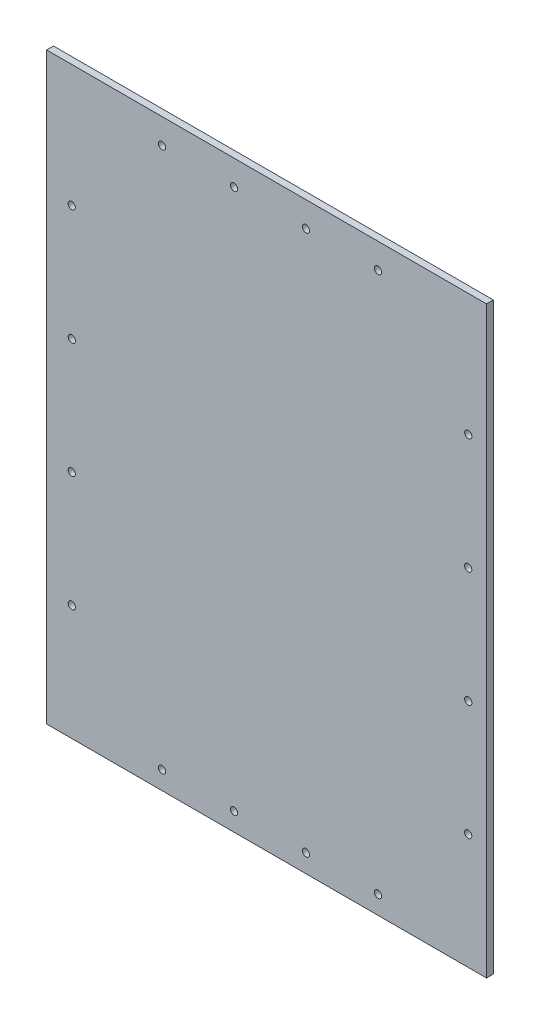
ISO-10303-21;
HEADER;
FILE_DESCRIPTION(('STEP AP214'),'2;1');
FILE_NAME('part.step','',(''),(''),'','','');
FILE_SCHEMA(('AUTOMOTIVE_DESIGN { 1 0 10303 214 1 1 1 1 }'));
ENDSEC;
DATA;
#1=APPLICATION_CONTEXT('core data for automotive mechanical design processes');
#2=APPLICATION_PROTOCOL_DEFINITION('international standard','automotive_design',2000,#1);
#3=PRODUCT_CONTEXT('',#1,'mechanical');
#4=PRODUCT('Part','Part','',(#3));
#5=PRODUCT_RELATED_PRODUCT_CATEGORY('part','',(#4));
#6=PRODUCT_DEFINITION_FORMATION('','',#4);
#7=PRODUCT_DEFINITION_CONTEXT('part definition',#1,'design');
#8=PRODUCT_DEFINITION('design','',#6,#7);
#9=PRODUCT_DEFINITION_SHAPE('','',#8);
#10=(LENGTH_UNIT() NAMED_UNIT(*) SI_UNIT(.MILLI.,.METRE.));
#11=(NAMED_UNIT(*) PLANE_ANGLE_UNIT() SI_UNIT($,.RADIAN.));
#12=(NAMED_UNIT(*) SI_UNIT($,.STERADIAN.) SOLID_ANGLE_UNIT());
#13=UNCERTAINTY_MEASURE_WITH_UNIT(LENGTH_MEASURE(1.E-05),#10,'distance_accuracy_value','');
#14=(GEOMETRIC_REPRESENTATION_CONTEXT(3) GLOBAL_UNCERTAINTY_ASSIGNED_CONTEXT((#13)) GLOBAL_UNIT_ASSIGNED_CONTEXT((#10,
#11,#12)) REPRESENTATION_CONTEXT('',''));
#15=CARTESIAN_POINT('',(0.,0.,0.));
#16=DIRECTION('',(0.,0.,1.));
#17=DIRECTION('',(1.,0.,0.));
#18=AXIS2_PLACEMENT_3D('',#15,#16,#17);
#19=CARTESIAN_POINT('',(-152.775,-202.775,4.75));
#20=DIRECTION('',(1.,0.,0.));
#21=DIRECTION('',(0.,0.,-1.));
#22=AXIS2_PLACEMENT_3D('',#19,#20,#21);
#23=PLANE('',#22);
#24=DIRECTION('',(0.,-1.,0.));
#25=VECTOR('',#24,1.);
#26=CARTESIAN_POINT('',(-152.775,-202.775,0.));
#27=LINE('',#26,#25);
#28=CARTESIAN_POINT('',(-152.775,202.775,0.));
#29=VERTEX_POINT('',#28);
#30=CARTESIAN_POINT('',(-152.775,-202.775,0.));
#31=VERTEX_POINT('',#30);
#32=EDGE_CURVE('E98',#29,#31,#27,.T.);
#33=ORIENTED_EDGE('',*,*,#32,.T.);
#34=DIRECTION('',(0.,0.,-1.));
#35=VECTOR('',#34,1.);
#36=CARTESIAN_POINT('',(-152.775,-202.775,4.75));
#37=LINE('',#36,#35);
#38=CARTESIAN_POINT('',(-152.775,-202.775,4.75));
#39=VERTEX_POINT('',#38);
#40=EDGE_CURVE('E11',#39,#31,#37,.T.);
#41=ORIENTED_EDGE('',*,*,#40,.F.);
#42=DIRECTION('',(0.,-1.,0.));
#43=VECTOR('',#42,1.);
#44=CARTESIAN_POINT('',(-152.775,-202.775,4.75));
#45=LINE('',#44,#43);
#46=CARTESIAN_POINT('',(-152.775,202.775,4.75));
#47=VERTEX_POINT('',#46);
#48=EDGE_CURVE('E85',#47,#39,#45,.T.);
#49=ORIENTED_EDGE('',*,*,#48,.F.);
#50=DIRECTION('',(0.,0.,-1.));
#51=VECTOR('',#50,1.);
#52=CARTESIAN_POINT('',(-152.775,202.775,4.75));
#53=LINE('',#52,#51);
#54=EDGE_CURVE('E94',#47,#29,#53,.T.);
#55=ORIENTED_EDGE('',*,*,#54,.T.);
#56=EDGE_LOOP('',(#33,#41,#49,#55));
#57=FACE_BOUND('',#56,.T.);
#58=ADVANCED_FACE('F32',(#57),#23,.F.);
#59=CARTESIAN_POINT('',(152.775,-202.775,4.75));
#60=DIRECTION('',(0.,1.,0.));
#61=DIRECTION('',(-1.,0.,0.));
#62=AXIS2_PLACEMENT_3D('',#59,#60,#61);
#63=PLANE('',#62);
#64=DIRECTION('',(1.,0.,0.));
#65=VECTOR('',#64,1.);
#66=CARTESIAN_POINT('',(152.775,-202.775,0.));
#67=LINE('',#66,#65);
#68=CARTESIAN_POINT('',(152.775,-202.775,0.));
#69=VERTEX_POINT('',#68);
#70=EDGE_CURVE('E89',#31,#69,#67,.T.);
#71=ORIENTED_EDGE('',*,*,#70,.T.);
#72=DIRECTION('',(0.,0.,-1.));
#73=VECTOR('',#72,1.);
#74=CARTESIAN_POINT('',(152.775,-202.775,4.75));
#75=LINE('',#74,#73);
#76=CARTESIAN_POINT('',(152.775,-202.775,4.75));
#77=VERTEX_POINT('',#76);
#78=EDGE_CURVE('E41',#77,#69,#75,.T.);
#79=ORIENTED_EDGE('',*,*,#78,.F.);
#80=DIRECTION('',(1.,0.,0.));
#81=VECTOR('',#80,1.);
#82=CARTESIAN_POINT('',(152.775,-202.775,4.75));
#83=LINE('',#82,#81);
#84=EDGE_CURVE('E80',#39,#77,#83,.T.);
#85=ORIENTED_EDGE('',*,*,#84,.F.);
#86=ORIENTED_EDGE('',*,*,#40,.T.);
#87=EDGE_LOOP('',(#71,#79,#85,#86));
#88=FACE_BOUND('',#87,.T.);
#89=ADVANCED_FACE('F88',(#88),#63,.F.);
#90=CARTESIAN_POINT('',(152.775,-202.775,4.75));
#91=DIRECTION('',(-1.,0.,0.));
#92=DIRECTION('',(0.,0.,1.));
#93=AXIS2_PLACEMENT_3D('',#90,#91,#92);
#94=PLANE('',#93);
#95=DIRECTION('',(0.,1.,0.));
#96=VECTOR('',#95,1.);
#97=CARTESIAN_POINT('',(152.775,-202.775,0.));
#98=LINE('',#97,#96);
#99=CARTESIAN_POINT('',(152.775,202.775,0.));
#100=VERTEX_POINT('',#99);
#101=EDGE_CURVE('E67',#69,#100,#98,.T.);
#102=ORIENTED_EDGE('',*,*,#101,.T.);
#103=DIRECTION('',(0.,0.,-1.));
#104=VECTOR('',#103,1.);
#105=CARTESIAN_POINT('',(152.775,202.775,4.75));
#106=LINE('',#105,#104);
#107=CARTESIAN_POINT('',(152.775,202.775,4.75));
#108=VERTEX_POINT('',#107);
#109=EDGE_CURVE('E90',#108,#100,#106,.T.);
#110=ORIENTED_EDGE('',*,*,#109,.F.);
#111=DIRECTION('',(0.,1.,0.));
#112=VECTOR('',#111,1.);
#113=CARTESIAN_POINT('',(152.775,-202.775,4.75));
#114=LINE('',#113,#112);
#115=EDGE_CURVE('E83',#77,#108,#114,.T.);
#116=ORIENTED_EDGE('',*,*,#115,.F.);
#117=ORIENTED_EDGE('',*,*,#78,.T.);
#118=EDGE_LOOP('',(#102,#110,#116,#117));
#119=FACE_BOUND('',#118,.T.);
#120=ADVANCED_FACE('F92',(#119),#94,.F.);
#121=CARTESIAN_POINT('',(152.775,202.775,4.75));
#122=DIRECTION('',(0.,-1.,0.));
#123=DIRECTION('',(1.,0.,0.));
#124=AXIS2_PLACEMENT_3D('',#121,#122,#123);
#125=PLANE('',#124);
#126=DIRECTION('',(-1.,0.,0.));
#127=VECTOR('',#126,1.);
#128=CARTESIAN_POINT('',(152.775,202.775,0.));
#129=LINE('',#128,#127);
#130=EDGE_CURVE('E73',#100,#29,#129,.T.);
#131=ORIENTED_EDGE('',*,*,#130,.T.);
#132=ORIENTED_EDGE('',*,*,#54,.F.);
#133=DIRECTION('',(-1.,0.,0.));
#134=VECTOR('',#133,1.);
#135=CARTESIAN_POINT('',(152.775,202.775,4.75));
#136=LINE('',#135,#134);
#137=EDGE_CURVE('E50',#108,#47,#136,.T.);
#138=ORIENTED_EDGE('',*,*,#137,.F.);
#139=ORIENTED_EDGE('',*,*,#109,.T.);
#140=EDGE_LOOP('',(#131,#132,#138,#139));
#141=FACE_BOUND('',#140,.T.);
#142=ADVANCED_FACE('F245',(#141),#125,.F.);
#143=CARTESIAN_POINT('',(0.,0.,4.75));
#144=DIRECTION('',(0.,0.,1.));
#145=DIRECTION('',(1.,0.,0.));
#146=AXIS2_PLACEMENT_3D('',#143,#144,#145);
#147=PLANE('',#146);
#148=CARTESIAN_POINT('',(77.375,-190.075,4.75));
#149=DIRECTION('',(0.,0.,1.));
#150=DIRECTION('',(1.,0.,0.));
#151=AXIS2_PLACEMENT_3D('',#148,#149,#150);
#152=CIRCLE('',#151,2.50000000000001);
#153=CARTESIAN_POINT('',(79.875,-190.075,4.75));
#154=VERTEX_POINT('',#153);
#155=EDGE_CURVE('E185',#154,#154,#152,.T.);
#156=ORIENTED_EDGE('',*,*,#155,.F.);
#157=EDGE_LOOP('',(#156));
#158=FACE_BOUND('',#157,.T.);
#159=CARTESIAN_POINT('',(27.375,-190.075,4.75));
#160=DIRECTION('',(0.,0.,1.));
#161=DIRECTION('',(1.,0.,0.));
#162=AXIS2_PLACEMENT_3D('',#159,#160,#161);
#163=CIRCLE('',#162,2.5);
#164=CARTESIAN_POINT('',(29.875,-190.075,4.75));
#165=VERTEX_POINT('',#164);
#166=EDGE_CURVE('E188',#165,#165,#163,.T.);
#167=ORIENTED_EDGE('',*,*,#166,.F.);
#168=EDGE_LOOP('',(#167));
#169=FACE_BOUND('',#168,.T.);
#170=CARTESIAN_POINT('',(-22.625,-190.075,4.75));
#171=DIRECTION('',(0.,0.,1.));
#172=DIRECTION('',(1.,0.,0.));
#173=AXIS2_PLACEMENT_3D('',#170,#171,#172);
#174=CIRCLE('',#173,2.5);
#175=CARTESIAN_POINT('',(-20.125,-190.075,4.75));
#176=VERTEX_POINT('',#175);
#177=EDGE_CURVE('E191',#176,#176,#174,.T.);
#178=ORIENTED_EDGE('',*,*,#177,.F.);
#179=EDGE_LOOP('',(#178));
#180=FACE_BOUND('',#179,.T.);
#181=CARTESIAN_POINT('',(-72.6250000000001,-190.075,4.75));
#182=DIRECTION('',(0.,0.,1.));
#183=DIRECTION('',(1.,0.,0.));
#184=AXIS2_PLACEMENT_3D('',#181,#182,#183);
#185=CIRCLE('',#184,2.5);
#186=CARTESIAN_POINT('',(-70.125,-190.075,4.75));
#187=VERTEX_POINT('',#186);
#188=EDGE_CURVE('E194',#187,#187,#185,.T.);
#189=ORIENTED_EDGE('',*,*,#188,.F.);
#190=EDGE_LOOP('',(#189));
#191=FACE_BOUND('',#190,.T.);
#192=CARTESIAN_POINT('',(-72.6250000000001,185.325,4.75));
#193=DIRECTION('',(0.,0.,1.));
#194=DIRECTION('',(1.,0.,0.));
#195=AXIS2_PLACEMENT_3D('',#192,#193,#194);
#196=CIRCLE('',#195,2.5);
#197=CARTESIAN_POINT('',(-70.125,185.325,4.75));
#198=VERTEX_POINT('',#197);
#199=EDGE_CURVE('E154',#198,#198,#196,.T.);
#200=ORIENTED_EDGE('',*,*,#199,.F.);
#201=EDGE_LOOP('',(#200));
#202=FACE_BOUND('',#201,.T.);
#203=CARTESIAN_POINT('',(77.375,185.325,4.75));
#204=DIRECTION('',(0.,0.,1.));
#205=DIRECTION('',(1.,0.,0.));
#206=AXIS2_PLACEMENT_3D('',#203,#204,#205);
#207=CIRCLE('',#206,2.50000000000001);
#208=CARTESIAN_POINT('',(79.875,185.325,4.75));
#209=VERTEX_POINT('',#208);
#210=EDGE_CURVE('E164',#209,#209,#207,.T.);
#211=ORIENTED_EDGE('',*,*,#210,.F.);
#212=EDGE_LOOP('',(#211));
#213=FACE_BOUND('',#212,.T.);
#214=CARTESIAN_POINT('',(27.375,185.325,4.75));
#215=DIRECTION('',(0.,0.,1.));
#216=DIRECTION('',(1.,0.,0.));
#217=AXIS2_PLACEMENT_3D('',#214,#215,#216);
#218=CIRCLE('',#217,2.5);
#219=CARTESIAN_POINT('',(29.875,185.325,4.75));
#220=VERTEX_POINT('',#219);
#221=EDGE_CURVE('E167',#220,#220,#218,.T.);
#222=ORIENTED_EDGE('',*,*,#221,.F.);
#223=EDGE_LOOP('',(#222));
#224=FACE_BOUND('',#223,.T.);
#225=CARTESIAN_POINT('',(-22.625,185.325,4.75));
#226=DIRECTION('',(0.,0.,1.));
#227=DIRECTION('',(1.,0.,0.));
#228=AXIS2_PLACEMENT_3D('',#225,#226,#227);
#229=CIRCLE('',#228,2.5);
#230=CARTESIAN_POINT('',(-20.125,185.325,4.75));
#231=VERTEX_POINT('',#230);
#232=EDGE_CURVE('E170',#231,#231,#229,.T.);
#233=ORIENTED_EDGE('',*,*,#232,.F.);
#234=EDGE_LOOP('',(#233));
#235=FACE_BOUND('',#234,.T.);
#236=CARTESIAN_POINT('',(-135.325,-122.615,4.75));
#237=DIRECTION('',(0.,0.,1.));
#238=DIRECTION('',(1.,0.,0.));
#239=AXIS2_PLACEMENT_3D('',#236,#237,#238);
#240=CIRCLE('',#239,2.5);
#241=CARTESIAN_POINT('',(-132.825,-122.615,4.75));
#242=VERTEX_POINT('',#241);
#243=EDGE_CURVE('E123',#242,#242,#240,.T.);
#244=ORIENTED_EDGE('',*,*,#243,.F.);
#245=EDGE_LOOP('',(#244));
#246=FACE_BOUND('',#245,.T.);
#247=CARTESIAN_POINT('',(-135.325,-42.455,4.75));
#248=DIRECTION('',(0.,0.,1.));
#249=DIRECTION('',(1.,0.,0.));
#250=AXIS2_PLACEMENT_3D('',#247,#248,#249);
#251=CIRCLE('',#250,2.5);
#252=CARTESIAN_POINT('',(-132.825,-42.455,4.75));
#253=VERTEX_POINT('',#252);
#254=EDGE_CURVE('E157',#253,#253,#251,.T.);
#255=ORIENTED_EDGE('',*,*,#254,.F.);
#256=EDGE_LOOP('',(#255));
#257=FACE_BOUND('',#256,.T.);
#258=CARTESIAN_POINT('',(-135.325,37.705,4.75));
#259=DIRECTION('',(0.,0.,1.));
#260=DIRECTION('',(1.,0.,0.));
#261=AXIS2_PLACEMENT_3D('',#258,#259,#260);
#262=CIRCLE('',#261,2.5);
#263=CARTESIAN_POINT('',(-132.825,37.705,4.75));
#264=VERTEX_POINT('',#263);
#265=EDGE_CURVE('E153',#264,#264,#262,.T.);
#266=ORIENTED_EDGE('',*,*,#265,.F.);
#267=EDGE_LOOP('',(#266));
#268=FACE_BOUND('',#267,.T.);
#269=CARTESIAN_POINT('',(-135.325,117.865,4.75));
#270=DIRECTION('',(0.,0.,1.));
#271=DIRECTION('',(1.,0.,0.));
#272=AXIS2_PLACEMENT_3D('',#269,#270,#271);
#273=CIRCLE('',#272,2.5);
#274=CARTESIAN_POINT('',(-132.825,117.865,4.75));
#275=VERTEX_POINT('',#274);
#276=EDGE_CURVE('E150',#275,#275,#273,.T.);
#277=ORIENTED_EDGE('',*,*,#276,.F.);
#278=EDGE_LOOP('',(#277));
#279=FACE_BOUND('',#278,.T.);
#280=CARTESIAN_POINT('',(140.075,-122.615,4.75));
#281=DIRECTION('',(0.,0.,1.));
#282=DIRECTION('',(1.,0.,0.));
#283=AXIS2_PLACEMENT_3D('',#280,#281,#282);
#284=CIRCLE('',#283,2.5);
#285=CARTESIAN_POINT('',(142.575,-122.615,4.75));
#286=VERTEX_POINT('',#285);
#287=EDGE_CURVE('E130',#286,#286,#284,.T.);
#288=ORIENTED_EDGE('',*,*,#287,.F.);
#289=EDGE_LOOP('',(#288));
#290=FACE_BOUND('',#289,.T.);
#291=CARTESIAN_POINT('',(140.075,-42.455,4.75));
#292=DIRECTION('',(0.,0.,1.));
#293=DIRECTION('',(1.,0.,0.));
#294=AXIS2_PLACEMENT_3D('',#291,#292,#293);
#295=CIRCLE('',#294,2.5);
#296=CARTESIAN_POINT('',(142.575,-42.455,4.75));
#297=VERTEX_POINT('',#296);
#298=EDGE_CURVE('E134',#297,#297,#295,.T.);
#299=ORIENTED_EDGE('',*,*,#298,.F.);
#300=EDGE_LOOP('',(#299));
#301=FACE_BOUND('',#300,.T.);
#302=CARTESIAN_POINT('',(140.075,117.865,4.75));
#303=DIRECTION('',(0.,0.,1.));
#304=DIRECTION('',(1.,0.,0.));
#305=AXIS2_PLACEMENT_3D('',#302,#303,#304);
#306=CIRCLE('',#305,2.5);
#307=CARTESIAN_POINT('',(142.575,117.865,4.75));
#308=VERTEX_POINT('',#307);
#309=EDGE_CURVE('E139',#308,#308,#306,.T.);
#310=ORIENTED_EDGE('',*,*,#309,.F.);
#311=EDGE_LOOP('',(#310));
#312=FACE_BOUND('',#311,.T.);
#313=CARTESIAN_POINT('',(140.075,37.705,4.75));
#314=DIRECTION('',(0.,0.,1.));
#315=DIRECTION('',(1.,0.,0.));
#316=AXIS2_PLACEMENT_3D('',#313,#314,#315);
#317=CIRCLE('',#316,2.5);
#318=CARTESIAN_POINT('',(142.575,37.705,4.75));
#319=VERTEX_POINT('',#318);
#320=EDGE_CURVE('E111',#319,#319,#317,.T.);
#321=ORIENTED_EDGE('',*,*,#320,.F.);
#322=EDGE_LOOP('',(#321));
#323=FACE_BOUND('',#322,.T.);
#324=ORIENTED_EDGE('',*,*,#48,.T.);
#325=ORIENTED_EDGE('',*,*,#84,.T.);
#326=ORIENTED_EDGE('',*,*,#115,.T.);
#327=ORIENTED_EDGE('',*,*,#137,.T.);
#328=EDGE_LOOP('',(#324,#325,#326,#327));
#329=FACE_BOUND('',#328,.T.);
#330=ADVANCED_FACE('F81',(#158,#169,#180,#191,#202,#213,#224,#235,#246,#257,#268,#279,#290,#301,
#312,#323,#329),#147,.T.);
#331=CARTESIAN_POINT('',(0.,0.,0.));
#332=DIRECTION('',(0.,0.,1.));
#333=DIRECTION('',(1.,0.,0.));
#334=AXIS2_PLACEMENT_3D('',#331,#332,#333);
#335=PLANE('',#334);
#336=CARTESIAN_POINT('',(77.375,-190.075,0.));
#337=DIRECTION('',(0.,0.,-1.));
#338=DIRECTION('',(-1.,0.,0.));
#339=AXIS2_PLACEMENT_3D('',#336,#337,#338);
#340=CIRCLE('',#339,2.50000000000001);
#341=CARTESIAN_POINT('',(74.8749999999999,-190.075,0.));
#342=VERTEX_POINT('',#341);
#343=EDGE_CURVE('E197',#342,#342,#340,.T.);
#344=ORIENTED_EDGE('',*,*,#343,.F.);
#345=EDGE_LOOP('',(#344));
#346=FACE_BOUND('',#345,.T.);
#347=CARTESIAN_POINT('',(27.375,-190.075,0.));
#348=DIRECTION('',(0.,0.,-1.));
#349=DIRECTION('',(-1.,0.,0.));
#350=AXIS2_PLACEMENT_3D('',#347,#348,#349);
#351=CIRCLE('',#350,2.5);
#352=CARTESIAN_POINT('',(24.875,-190.075,0.));
#353=VERTEX_POINT('',#352);
#354=EDGE_CURVE('E204',#353,#353,#351,.T.);
#355=ORIENTED_EDGE('',*,*,#354,.F.);
#356=EDGE_LOOP('',(#355));
#357=FACE_BOUND('',#356,.T.);
#358=CARTESIAN_POINT('',(-22.625,-190.075,0.));
#359=DIRECTION('',(0.,0.,-1.));
#360=DIRECTION('',(-1.,0.,0.));
#361=AXIS2_PLACEMENT_3D('',#358,#359,#360);
#362=CIRCLE('',#361,2.5);
#363=CARTESIAN_POINT('',(-25.125,-190.075,0.));
#364=VERTEX_POINT('',#363);
#365=EDGE_CURVE('E201',#364,#364,#362,.T.);
#366=ORIENTED_EDGE('',*,*,#365,.F.);
#367=EDGE_LOOP('',(#366));
#368=FACE_BOUND('',#367,.T.);
#369=CARTESIAN_POINT('',(-72.6250000000001,-190.075,0.));
#370=DIRECTION('',(0.,0.,-1.));
#371=DIRECTION('',(-1.,0.,0.));
#372=AXIS2_PLACEMENT_3D('',#369,#370,#371);
#373=CIRCLE('',#372,2.5);
#374=CARTESIAN_POINT('',(-75.1250000000001,-190.075,0.));
#375=VERTEX_POINT('',#374);
#376=EDGE_CURVE('E198',#375,#375,#373,.T.);
#377=ORIENTED_EDGE('',*,*,#376,.F.);
#378=EDGE_LOOP('',(#377));
#379=FACE_BOUND('',#378,.T.);
#380=CARTESIAN_POINT('',(-72.6250000000001,185.325,0.));
#381=DIRECTION('',(0.,0.,-1.));
#382=DIRECTION('',(-1.,0.,0.));
#383=AXIS2_PLACEMENT_3D('',#380,#381,#382);
#384=CIRCLE('',#383,2.5);
#385=CARTESIAN_POINT('',(-75.1250000000001,185.325,0.));
#386=VERTEX_POINT('',#385);
#387=EDGE_CURVE('E176',#386,#386,#384,.T.);
#388=ORIENTED_EDGE('',*,*,#387,.F.);
#389=EDGE_LOOP('',(#388));
#390=FACE_BOUND('',#389,.T.);
#391=CARTESIAN_POINT('',(77.375,185.325,0.));
#392=DIRECTION('',(0.,0.,-1.));
#393=DIRECTION('',(-1.,0.,0.));
#394=AXIS2_PLACEMENT_3D('',#391,#392,#393);
#395=CIRCLE('',#394,2.50000000000001);
#396=CARTESIAN_POINT('',(74.8749999999999,185.325,0.));
#397=VERTEX_POINT('',#396);
#398=EDGE_CURVE('E177',#397,#397,#395,.T.);
#399=ORIENTED_EDGE('',*,*,#398,.F.);
#400=EDGE_LOOP('',(#399));
#401=FACE_BOUND('',#400,.T.);
#402=CARTESIAN_POINT('',(27.375,185.325,0.));
#403=DIRECTION('',(0.,0.,-1.));
#404=DIRECTION('',(-1.,0.,0.));
#405=AXIS2_PLACEMENT_3D('',#402,#403,#404);
#406=CIRCLE('',#405,2.5);
#407=CARTESIAN_POINT('',(24.875,185.325,0.));
#408=VERTEX_POINT('',#407);
#409=EDGE_CURVE('E180',#408,#408,#406,.T.);
#410=ORIENTED_EDGE('',*,*,#409,.F.);
#411=EDGE_LOOP('',(#410));
#412=FACE_BOUND('',#411,.T.);
#413=CARTESIAN_POINT('',(-22.625,185.325,0.));
#414=DIRECTION('',(0.,0.,-1.));
#415=DIRECTION('',(-1.,0.,0.));
#416=AXIS2_PLACEMENT_3D('',#413,#414,#415);
#417=CIRCLE('',#416,2.5);
#418=CARTESIAN_POINT('',(-25.125,185.325,0.));
#419=VERTEX_POINT('',#418);
#420=EDGE_CURVE('E173',#419,#419,#417,.T.);
#421=ORIENTED_EDGE('',*,*,#420,.F.);
#422=EDGE_LOOP('',(#421));
#423=FACE_BOUND('',#422,.T.);
#424=CARTESIAN_POINT('',(-135.325,-122.615,0.));
#425=DIRECTION('',(0.,0.,1.));
#426=DIRECTION('',(1.,0.,0.));
#427=AXIS2_PLACEMENT_3D('',#424,#425,#426);
#428=CIRCLE('',#427,2.5);
#429=CARTESIAN_POINT('',(-132.825,-122.615,0.));
#430=VERTEX_POINT('',#429);
#431=EDGE_CURVE('E35',#430,#430,#428,.T.);
#432=ORIENTED_EDGE('',*,*,#431,.T.);
#433=EDGE_LOOP('',(#432));
#434=FACE_BOUND('',#433,.T.);
#435=CARTESIAN_POINT('',(-135.325,-42.455,0.));
#436=DIRECTION('',(0.,0.,1.));
#437=DIRECTION('',(1.,0.,0.));
#438=AXIS2_PLACEMENT_3D('',#435,#436,#437);
#439=CIRCLE('',#438,2.5);
#440=CARTESIAN_POINT('',(-132.825,-42.455,0.));
#441=VERTEX_POINT('',#440);
#442=EDGE_CURVE('E125',#441,#441,#439,.T.);
#443=ORIENTED_EDGE('',*,*,#442,.T.);
#444=EDGE_LOOP('',(#443));
#445=FACE_BOUND('',#444,.T.);
#446=CARTESIAN_POINT('',(-135.325,37.705,0.));
#447=DIRECTION('',(0.,0.,1.));
#448=DIRECTION('',(1.,0.,0.));
#449=AXIS2_PLACEMENT_3D('',#446,#447,#448);
#450=CIRCLE('',#449,2.5);
#451=CARTESIAN_POINT('',(-132.825,37.705,0.));
#452=VERTEX_POINT('',#451);
#453=EDGE_CURVE('E122',#452,#452,#450,.T.);
#454=ORIENTED_EDGE('',*,*,#453,.T.);
#455=EDGE_LOOP('',(#454));
#456=FACE_BOUND('',#455,.T.);
#457=CARTESIAN_POINT('',(-135.325,117.865,0.));
#458=DIRECTION('',(0.,0.,1.));
#459=DIRECTION('',(1.,0.,0.));
#460=AXIS2_PLACEMENT_3D('',#457,#458,#459);
#461=CIRCLE('',#460,2.5);
#462=CARTESIAN_POINT('',(-132.825,117.865,0.));
#463=VERTEX_POINT('',#462);
#464=EDGE_CURVE('E119',#463,#463,#461,.T.);
#465=ORIENTED_EDGE('',*,*,#464,.T.);
#466=EDGE_LOOP('',(#465));
#467=FACE_BOUND('',#466,.T.);
#468=CARTESIAN_POINT('',(140.075,-122.615,0.));
#469=DIRECTION('',(0.,0.,1.));
#470=DIRECTION('',(1.,0.,0.));
#471=AXIS2_PLACEMENT_3D('',#468,#469,#470);
#472=CIRCLE('',#471,2.5);
#473=CARTESIAN_POINT('',(142.575,-122.615,0.));
#474=VERTEX_POINT('',#473);
#475=EDGE_CURVE('E101',#474,#474,#472,.T.);
#476=ORIENTED_EDGE('',*,*,#475,.T.);
#477=EDGE_LOOP('',(#476));
#478=FACE_BOUND('',#477,.T.);
#479=CARTESIAN_POINT('',(140.075,-42.455,0.));
#480=DIRECTION('',(0.,0.,1.));
#481=DIRECTION('',(1.,0.,0.));
#482=AXIS2_PLACEMENT_3D('',#479,#480,#481);
#483=CIRCLE('',#482,2.5);
#484=CARTESIAN_POINT('',(142.575,-42.455,0.));
#485=VERTEX_POINT('',#484);
#486=EDGE_CURVE('E114',#485,#485,#483,.T.);
#487=ORIENTED_EDGE('',*,*,#486,.T.);
#488=EDGE_LOOP('',(#487));
#489=FACE_BOUND('',#488,.T.);
#490=CARTESIAN_POINT('',(140.075,117.865,0.));
#491=DIRECTION('',(0.,0.,1.));
#492=DIRECTION('',(1.,0.,0.));
#493=AXIS2_PLACEMENT_3D('',#490,#491,#492);
#494=CIRCLE('',#493,2.5);
#495=CARTESIAN_POINT('',(142.575,117.865,0.));
#496=VERTEX_POINT('',#495);
#497=EDGE_CURVE('E110',#496,#496,#494,.T.);
#498=ORIENTED_EDGE('',*,*,#497,.T.);
#499=EDGE_LOOP('',(#498));
#500=FACE_BOUND('',#499,.T.);
#501=CARTESIAN_POINT('',(140.075,37.705,0.));
#502=DIRECTION('',(0.,0.,1.));
#503=DIRECTION('',(1.,0.,0.));
#504=AXIS2_PLACEMENT_3D('',#501,#502,#503);
#505=CIRCLE('',#504,2.5);
#506=CARTESIAN_POINT('',(142.575,37.705,0.));
#507=VERTEX_POINT('',#506);
#508=EDGE_CURVE('E107',#507,#507,#505,.T.);
#509=ORIENTED_EDGE('',*,*,#508,.T.);
#510=EDGE_LOOP('',(#509));
#511=FACE_BOUND('',#510,.T.);
#512=ORIENTED_EDGE('',*,*,#32,.F.);
#513=ORIENTED_EDGE('',*,*,#130,.F.);
#514=ORIENTED_EDGE('',*,*,#101,.F.);
#515=ORIENTED_EDGE('',*,*,#70,.F.);
#516=EDGE_LOOP('',(#512,#513,#514,#515));
#517=FACE_BOUND('',#516,.T.);
#518=ADVANCED_FACE('F212',(#346,#357,#368,#379,#390,#401,#412,#423,#434,#445,#456,#467,#478,
#489,#500,#511,#517),#335,.F.);
#519=CARTESIAN_POINT('',(140.075,37.705,-5.25));
#520=DIRECTION('',(0.,0.,1.));
#521=DIRECTION('',(1.,0.,0.));
#522=AXIS2_PLACEMENT_3D('',#519,#520,#521);
#523=CYLINDRICAL_SURFACE('',#522,2.5);
#524=ORIENTED_EDGE('',*,*,#320,.T.);
#525=EDGE_LOOP('',(#524));
#526=FACE_BOUND('',#525,.T.);
#527=ORIENTED_EDGE('',*,*,#508,.F.);
#528=EDGE_LOOP('',(#527));
#529=FACE_BOUND('',#528,.T.);
#530=ADVANCED_FACE('F215',(#526,#529),#523,.F.);
#531=CARTESIAN_POINT('',(140.075,117.865,-5.25));
#532=DIRECTION('',(0.,0.,1.));
#533=DIRECTION('',(1.,0.,0.));
#534=AXIS2_PLACEMENT_3D('',#531,#532,#533);
#535=CYLINDRICAL_SURFACE('',#534,2.5);
#536=ORIENTED_EDGE('',*,*,#309,.T.);
#537=EDGE_LOOP('',(#536));
#538=FACE_BOUND('',#537,.T.);
#539=ORIENTED_EDGE('',*,*,#497,.F.);
#540=EDGE_LOOP('',(#539));
#541=FACE_BOUND('',#540,.T.);
#542=ADVANCED_FACE('F280',(#538,#541),#535,.F.);
#543=CARTESIAN_POINT('',(140.075,-42.455,-5.25));
#544=DIRECTION('',(0.,0.,1.));
#545=DIRECTION('',(1.,0.,0.));
#546=AXIS2_PLACEMENT_3D('',#543,#544,#545);
#547=CYLINDRICAL_SURFACE('',#546,2.5);
#548=ORIENTED_EDGE('',*,*,#298,.T.);
#549=EDGE_LOOP('',(#548));
#550=FACE_BOUND('',#549,.T.);
#551=ORIENTED_EDGE('',*,*,#486,.F.);
#552=EDGE_LOOP('',(#551));
#553=FACE_BOUND('',#552,.T.);
#554=ADVANCED_FACE('F291',(#550,#553),#547,.F.);
#555=CARTESIAN_POINT('',(140.075,-122.615,-5.25));
#556=DIRECTION('',(0.,0.,1.));
#557=DIRECTION('',(1.,0.,0.));
#558=AXIS2_PLACEMENT_3D('',#555,#556,#557);
#559=CYLINDRICAL_SURFACE('',#558,2.5);
#560=ORIENTED_EDGE('',*,*,#287,.T.);
#561=EDGE_LOOP('',(#560));
#562=FACE_BOUND('',#561,.T.);
#563=ORIENTED_EDGE('',*,*,#475,.F.);
#564=EDGE_LOOP('',(#563));
#565=FACE_BOUND('',#564,.T.);
#566=ADVANCED_FACE('F300',(#562,#565),#559,.F.);
#567=CARTESIAN_POINT('',(-135.325,117.865,-5.25));
#568=DIRECTION('',(0.,0.,1.));
#569=DIRECTION('',(1.,0.,0.));
#570=AXIS2_PLACEMENT_3D('',#567,#568,#569);
#571=CYLINDRICAL_SURFACE('',#570,2.5);
#572=ORIENTED_EDGE('',*,*,#276,.T.);
#573=EDGE_LOOP('',(#572));
#574=FACE_BOUND('',#573,.T.);
#575=ORIENTED_EDGE('',*,*,#464,.F.);
#576=EDGE_LOOP('',(#575));
#577=FACE_BOUND('',#576,.T.);
#578=ADVANCED_FACE('F310',(#574,#577),#571,.F.);
#579=CARTESIAN_POINT('',(-135.325,37.705,-5.25));
#580=DIRECTION('',(0.,0.,1.));
#581=DIRECTION('',(1.,0.,0.));
#582=AXIS2_PLACEMENT_3D('',#579,#580,#581);
#583=CYLINDRICAL_SURFACE('',#582,2.5);
#584=ORIENTED_EDGE('',*,*,#265,.T.);
#585=EDGE_LOOP('',(#584));
#586=FACE_BOUND('',#585,.T.);
#587=ORIENTED_EDGE('',*,*,#453,.F.);
#588=EDGE_LOOP('',(#587));
#589=FACE_BOUND('',#588,.T.);
#590=ADVANCED_FACE('F319',(#586,#589),#583,.F.);
#591=CARTESIAN_POINT('',(-135.325,-42.455,-5.25));
#592=DIRECTION('',(0.,0.,1.));
#593=DIRECTION('',(1.,0.,0.));
#594=AXIS2_PLACEMENT_3D('',#591,#592,#593);
#595=CYLINDRICAL_SURFACE('',#594,2.5);
#596=ORIENTED_EDGE('',*,*,#254,.T.);
#597=EDGE_LOOP('',(#596));
#598=FACE_BOUND('',#597,.T.);
#599=ORIENTED_EDGE('',*,*,#442,.F.);
#600=EDGE_LOOP('',(#599));
#601=FACE_BOUND('',#600,.T.);
#602=ADVANCED_FACE('F329',(#598,#601),#595,.F.);
#603=CARTESIAN_POINT('',(-135.325,-122.615,-5.25));
#604=DIRECTION('',(0.,0.,1.));
#605=DIRECTION('',(1.,0.,0.));
#606=AXIS2_PLACEMENT_3D('',#603,#604,#605);
#607=CYLINDRICAL_SURFACE('',#606,2.5);
#608=ORIENTED_EDGE('',*,*,#243,.T.);
#609=EDGE_LOOP('',(#608));
#610=FACE_BOUND('',#609,.T.);
#611=ORIENTED_EDGE('',*,*,#431,.F.);
#612=EDGE_LOOP('',(#611));
#613=FACE_BOUND('',#612,.T.);
#614=ADVANCED_FACE('F339',(#610,#613),#607,.F.);
#615=CARTESIAN_POINT('',(-22.625,185.325,10.));
#616=DIRECTION('',(0.,0.,-1.));
#617=DIRECTION('',(-1.,0.,0.));
#618=AXIS2_PLACEMENT_3D('',#615,#616,#617);
#619=CYLINDRICAL_SURFACE('',#618,2.5);
#620=ORIENTED_EDGE('',*,*,#232,.T.);
#621=EDGE_LOOP('',(#620));
#622=FACE_BOUND('',#621,.T.);
#623=ORIENTED_EDGE('',*,*,#420,.T.);
#624=EDGE_LOOP('',(#623));
#625=FACE_BOUND('',#624,.T.);
#626=ADVANCED_FACE('F349',(#622,#625),#619,.F.);
#627=CARTESIAN_POINT('',(27.375,185.325,10.));
#628=DIRECTION('',(0.,0.,-1.));
#629=DIRECTION('',(-1.,0.,0.));
#630=AXIS2_PLACEMENT_3D('',#627,#628,#629);
#631=CYLINDRICAL_SURFACE('',#630,2.5);
#632=ORIENTED_EDGE('',*,*,#221,.T.);
#633=EDGE_LOOP('',(#632));
#634=FACE_BOUND('',#633,.T.);
#635=ORIENTED_EDGE('',*,*,#409,.T.);
#636=EDGE_LOOP('',(#635));
#637=FACE_BOUND('',#636,.T.);
#638=ADVANCED_FACE('F359',(#634,#637),#631,.F.);
#639=CARTESIAN_POINT('',(77.375,185.325,10.));
#640=DIRECTION('',(0.,0.,-1.));
#641=DIRECTION('',(-1.,0.,0.));
#642=AXIS2_PLACEMENT_3D('',#639,#640,#641);
#643=CYLINDRICAL_SURFACE('',#642,2.50000000000001);
#644=ORIENTED_EDGE('',*,*,#210,.T.);
#645=EDGE_LOOP('',(#644));
#646=FACE_BOUND('',#645,.T.);
#647=ORIENTED_EDGE('',*,*,#398,.T.);
#648=EDGE_LOOP('',(#647));
#649=FACE_BOUND('',#648,.T.);
#650=ADVANCED_FACE('F369',(#646,#649),#643,.F.);
#651=CARTESIAN_POINT('',(-72.6250000000001,185.325,10.));
#652=DIRECTION('',(0.,0.,-1.));
#653=DIRECTION('',(-1.,0.,0.));
#654=AXIS2_PLACEMENT_3D('',#651,#652,#653);
#655=CYLINDRICAL_SURFACE('',#654,2.5);
#656=ORIENTED_EDGE('',*,*,#199,.T.);
#657=EDGE_LOOP('',(#656));
#658=FACE_BOUND('',#657,.T.);
#659=ORIENTED_EDGE('',*,*,#387,.T.);
#660=EDGE_LOOP('',(#659));
#661=FACE_BOUND('',#660,.T.);
#662=ADVANCED_FACE('F379',(#658,#661),#655,.F.);
#663=CARTESIAN_POINT('',(-72.6250000000001,-190.075,10.));
#664=DIRECTION('',(0.,0.,-1.));
#665=DIRECTION('',(-1.,0.,0.));
#666=AXIS2_PLACEMENT_3D('',#663,#664,#665);
#667=CYLINDRICAL_SURFACE('',#666,2.5);
#668=ORIENTED_EDGE('',*,*,#188,.T.);
#669=EDGE_LOOP('',(#668));
#670=FACE_BOUND('',#669,.T.);
#671=ORIENTED_EDGE('',*,*,#376,.T.);
#672=EDGE_LOOP('',(#671));
#673=FACE_BOUND('',#672,.T.);
#674=ADVANCED_FACE('F388',(#670,#673),#667,.F.);
#675=CARTESIAN_POINT('',(-22.625,-190.075,10.));
#676=DIRECTION('',(0.,0.,-1.));
#677=DIRECTION('',(-1.,0.,0.));
#678=AXIS2_PLACEMENT_3D('',#675,#676,#677);
#679=CYLINDRICAL_SURFACE('',#678,2.5);
#680=ORIENTED_EDGE('',*,*,#177,.T.);
#681=EDGE_LOOP('',(#680));
#682=FACE_BOUND('',#681,.T.);
#683=ORIENTED_EDGE('',*,*,#365,.T.);
#684=EDGE_LOOP('',(#683));
#685=FACE_BOUND('',#684,.T.);
#686=ADVANCED_FACE('F403',(#682,#685),#679,.F.);
#687=CARTESIAN_POINT('',(27.375,-190.075,10.));
#688=DIRECTION('',(0.,0.,-1.));
#689=DIRECTION('',(-1.,0.,0.));
#690=AXIS2_PLACEMENT_3D('',#687,#688,#689);
#691=CYLINDRICAL_SURFACE('',#690,2.5);
#692=ORIENTED_EDGE('',*,*,#166,.T.);
#693=EDGE_LOOP('',(#692));
#694=FACE_BOUND('',#693,.T.);
#695=ORIENTED_EDGE('',*,*,#354,.T.);
#696=EDGE_LOOP('',(#695));
#697=FACE_BOUND('',#696,.T.);
#698=ADVANCED_FACE('F413',(#694,#697),#691,.F.);
#699=CARTESIAN_POINT('',(77.375,-190.075,10.));
#700=DIRECTION('',(0.,0.,-1.));
#701=DIRECTION('',(-1.,0.,0.));
#702=AXIS2_PLACEMENT_3D('',#699,#700,#701);
#703=CYLINDRICAL_SURFACE('',#702,2.50000000000001);
#704=ORIENTED_EDGE('',*,*,#155,.T.);
#705=EDGE_LOOP('',(#704));
#706=FACE_BOUND('',#705,.T.);
#707=ORIENTED_EDGE('',*,*,#343,.T.);
#708=EDGE_LOOP('',(#707));
#709=FACE_BOUND('',#708,.T.);
#710=ADVANCED_FACE('F210',(#706,#709),#703,.F.);
#711=CLOSED_SHELL('',(#58,#89,#120,#142,#330,#518,#530,#542,#554,#566,#578,#590,#602,#614,#626,
#638,#650,#662,#674,#686,#698,#710));
#712=MANIFOLD_SOLID_BREP('B2',#711);
#713=ADVANCED_BREP_SHAPE_REPRESENTATION('',(#18,#712),#14);
#714=SHAPE_DEFINITION_REPRESENTATION(#9,#713);
ENDSEC;
END-ISO-10303-21;
